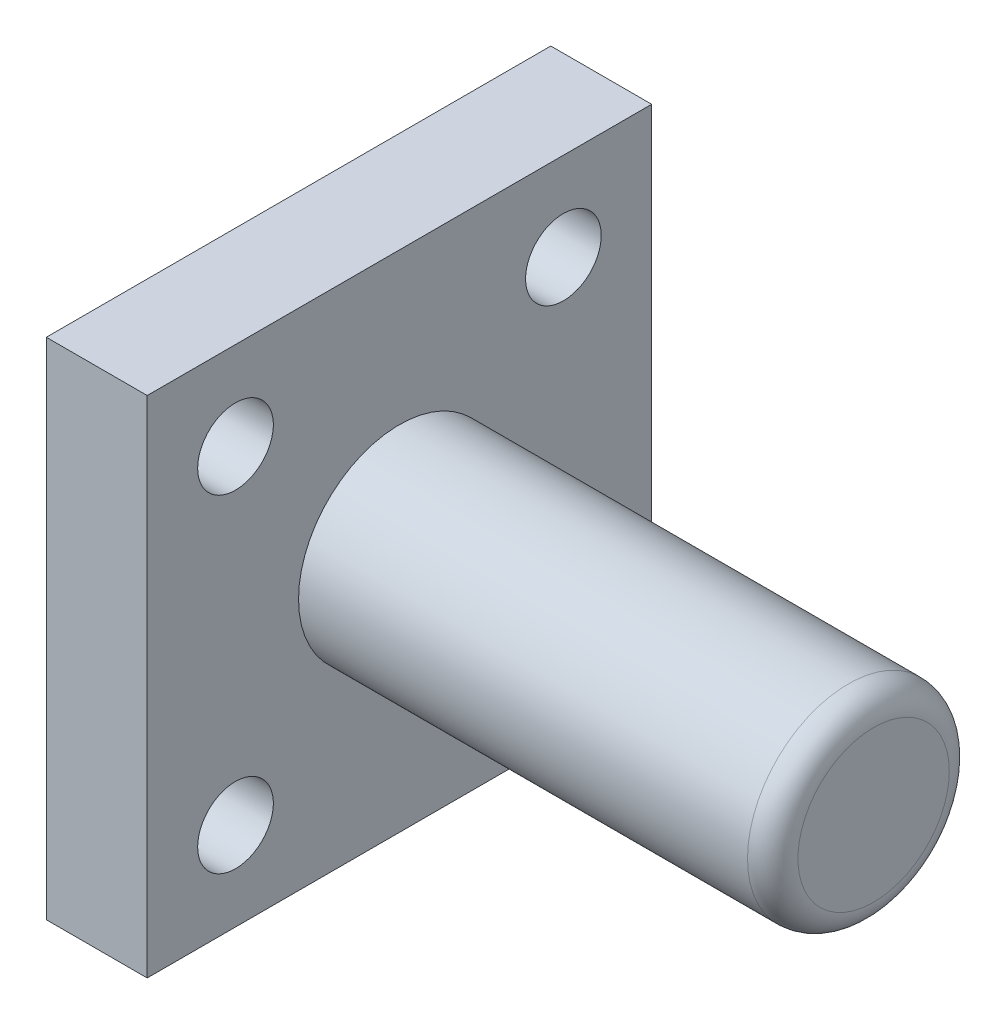
ISO-10303-21;
HEADER;
FILE_DESCRIPTION(('STEP AP214'),'2;1');
FILE_NAME('part.step','',(''),(''),'','','');
FILE_SCHEMA(('AUTOMOTIVE_DESIGN { 1 0 10303 214 1 1 1 1 }'));
ENDSEC;
DATA;
#1=APPLICATION_CONTEXT('core data for automotive mechanical design processes');
#2=APPLICATION_PROTOCOL_DEFINITION('international standard','automotive_design',2000,#1);
#3=PRODUCT_CONTEXT('',#1,'mechanical');
#4=PRODUCT('Part','Part','',(#3));
#5=PRODUCT_RELATED_PRODUCT_CATEGORY('part','',(#4));
#6=PRODUCT_DEFINITION_FORMATION('','',#4);
#7=PRODUCT_DEFINITION_CONTEXT('part definition',#1,'design');
#8=PRODUCT_DEFINITION('design','',#6,#7);
#9=PRODUCT_DEFINITION_SHAPE('','',#8);
#10=(LENGTH_UNIT() NAMED_UNIT(*) SI_UNIT(.MILLI.,.METRE.));
#11=(NAMED_UNIT(*) PLANE_ANGLE_UNIT() SI_UNIT($,.RADIAN.));
#12=(NAMED_UNIT(*) SI_UNIT($,.STERADIAN.) SOLID_ANGLE_UNIT());
#13=UNCERTAINTY_MEASURE_WITH_UNIT(LENGTH_MEASURE(1.E-05),#10,'distance_accuracy_value','');
#14=(GEOMETRIC_REPRESENTATION_CONTEXT(3) GLOBAL_UNCERTAINTY_ASSIGNED_CONTEXT((#13)) GLOBAL_UNIT_ASSIGNED_CONTEXT((#10,
#11,#12)) REPRESENTATION_CONTEXT('',''));
#15=CARTESIAN_POINT('',(0.,0.,0.));
#16=DIRECTION('',(0.,0.,1.));
#17=DIRECTION('',(1.,0.,0.));
#18=AXIS2_PLACEMENT_3D('',#15,#16,#17);
#19=CARTESIAN_POINT('',(4.,0.,0.));
#20=DIRECTION('',(-1.,0.,0.));
#21=DIRECTION('',(0.,0.,1.));
#22=AXIS2_PLACEMENT_3D('',#19,#20,#21);
#23=PLANE('',#22);
#24=CARTESIAN_POINT('',(4.,-6.5,-6.5));
#25=DIRECTION('',(-1.,0.,0.));
#26=DIRECTION('',(0.,0.,1.));
#27=AXIS2_PLACEMENT_3D('',#24,#25,#26);
#28=CIRCLE('',#27,1.5);
#29=CARTESIAN_POINT('',(4.,-6.5,-5.00000000000001));
#30=VERTEX_POINT('',#29);
#31=EDGE_CURVE('E255',#30,#30,#28,.T.);
#32=ORIENTED_EDGE('',*,*,#31,.T.);
#33=EDGE_LOOP('',(#32));
#34=FACE_BOUND('',#33,.T.);
#35=CARTESIAN_POINT('',(4.,6.5,-6.5));
#36=DIRECTION('',(-1.,0.,0.));
#37=DIRECTION('',(0.,0.,1.));
#38=AXIS2_PLACEMENT_3D('',#35,#36,#37);
#39=CIRCLE('',#38,1.5);
#40=CARTESIAN_POINT('',(4.,6.5,-5.00000000000001));
#41=VERTEX_POINT('',#40);
#42=EDGE_CURVE('E249',#41,#41,#39,.T.);
#43=ORIENTED_EDGE('',*,*,#42,.T.);
#44=EDGE_LOOP('',(#43));
#45=FACE_BOUND('',#44,.T.);
#46=CARTESIAN_POINT('',(4.,6.5,6.5));
#47=DIRECTION('',(-1.,0.,0.));
#48=DIRECTION('',(0.,0.,1.));
#49=AXIS2_PLACEMENT_3D('',#46,#47,#48);
#50=CIRCLE('',#49,1.5);
#51=CARTESIAN_POINT('',(4.,6.5,7.99999999999999));
#52=VERTEX_POINT('',#51);
#53=EDGE_CURVE('E253',#52,#52,#50,.T.);
#54=ORIENTED_EDGE('',*,*,#53,.T.);
#55=EDGE_LOOP('',(#54));
#56=FACE_BOUND('',#55,.T.);
#57=CARTESIAN_POINT('',(4.,-6.5,6.5));
#58=DIRECTION('',(-1.,0.,0.));
#59=DIRECTION('',(0.,0.,1.));
#60=AXIS2_PLACEMENT_3D('',#57,#58,#59);
#61=CIRCLE('',#60,1.5);
#62=CARTESIAN_POINT('',(4.,-6.5,7.99999999999999));
#63=VERTEX_POINT('',#62);
#64=EDGE_CURVE('E107',#63,#63,#61,.T.);
#65=ORIENTED_EDGE('',*,*,#64,.T.);
#66=EDGE_LOOP('',(#65));
#67=FACE_BOUND('',#66,.T.);
#68=DIRECTION('',(0.,1.,0.));
#69=VECTOR('',#68,1.);
#70=CARTESIAN_POINT('',(4.,-10.,-10.));
#71=LINE('',#70,#69);
#72=CARTESIAN_POINT('',(4.,-10.,-10.));
#73=VERTEX_POINT('',#72);
#74=CARTESIAN_POINT('',(4.,10.,-10.));
#75=VERTEX_POINT('',#74);
#76=EDGE_CURVE('E89',#73,#75,#71,.T.);
#77=ORIENTED_EDGE('',*,*,#76,.T.);
#78=DIRECTION('',(0.,0.,1.));
#79=VECTOR('',#78,1.);
#80=CARTESIAN_POINT('',(4.,10.,10.));
#81=LINE('',#80,#79);
#82=CARTESIAN_POINT('',(4.,10.,10.));
#83=VERTEX_POINT('',#82);
#84=EDGE_CURVE('E84',#75,#83,#81,.T.);
#85=ORIENTED_EDGE('',*,*,#84,.T.);
#86=DIRECTION('',(0.,-1.,0.));
#87=VECTOR('',#86,1.);
#88=CARTESIAN_POINT('',(4.,-10.,10.));
#89=LINE('',#88,#87);
#90=CARTESIAN_POINT('',(4.,-10.,10.));
#91=VERTEX_POINT('',#90);
#92=EDGE_CURVE('E87',#83,#91,#89,.T.);
#93=ORIENTED_EDGE('',*,*,#92,.T.);
#94=DIRECTION('',(0.,0.,-1.));
#95=VECTOR('',#94,1.);
#96=CARTESIAN_POINT('',(4.,-10.,10.));
#97=LINE('',#96,#95);
#98=EDGE_CURVE('E53',#91,#73,#97,.T.);
#99=ORIENTED_EDGE('',*,*,#98,.T.);
#100=EDGE_LOOP('',(#77,#85,#93,#99));
#101=FACE_BOUND('',#100,.T.);
#102=CARTESIAN_POINT('',(4.,0.,0.));
#103=DIRECTION('',(-1.,0.,0.));
#104=DIRECTION('',(0.,0.,1.));
#105=AXIS2_PLACEMENT_3D('',#102,#103,#104);
#106=CIRCLE('',#105,4.);
#107=CARTESIAN_POINT('',(4.,0.,4.));
#108=VERTEX_POINT('',#107);
#109=EDGE_CURVE('E114',#108,#108,#106,.F.);
#110=ORIENTED_EDGE('',*,*,#109,.F.);
#111=EDGE_LOOP('',(#110));
#112=FACE_BOUND('',#111,.T.);
#113=ADVANCED_FACE('F36',(#34,#45,#56,#67,#101,#112),#23,.F.);
#114=CARTESIAN_POINT('',(4.,-10.,-10.));
#115=DIRECTION('',(0.,0.,1.));
#116=DIRECTION('',(1.,0.,0.));
#117=AXIS2_PLACEMENT_3D('',#114,#115,#116);
#118=PLANE('',#117);
#119=DIRECTION('',(0.,1.,0.));
#120=VECTOR('',#119,1.);
#121=CARTESIAN_POINT('',(0.,-10.,-10.));
#122=LINE('',#121,#120);
#123=CARTESIAN_POINT('',(0.,-10.,-10.));
#124=VERTEX_POINT('',#123);
#125=CARTESIAN_POINT('',(0.,10.,-10.));
#126=VERTEX_POINT('',#125);
#127=EDGE_CURVE('E104',#124,#126,#122,.T.);
#128=ORIENTED_EDGE('',*,*,#127,.T.);
#129=DIRECTION('',(-1.,0.,0.));
#130=VECTOR('',#129,1.);
#131=CARTESIAN_POINT('',(4.,10.,-10.));
#132=LINE('',#131,#130);
#133=EDGE_CURVE('E95',#75,#126,#132,.T.);
#134=ORIENTED_EDGE('',*,*,#133,.F.);
#135=ORIENTED_EDGE('',*,*,#76,.F.);
#136=DIRECTION('',(-1.,0.,0.));
#137=VECTOR('',#136,1.);
#138=CARTESIAN_POINT('',(4.,-10.,-10.));
#139=LINE('',#138,#137);
#140=EDGE_CURVE('E100',#73,#124,#139,.T.);
#141=ORIENTED_EDGE('',*,*,#140,.T.);
#142=EDGE_LOOP('',(#128,#134,#135,#141));
#143=FACE_BOUND('',#142,.T.);
#144=ADVANCED_FACE('F132',(#143),#118,.F.);
#145=CARTESIAN_POINT('',(4.,10.,10.));
#146=DIRECTION('',(0.,-1.,0.));
#147=DIRECTION('',(0.,0.,-1.));
#148=AXIS2_PLACEMENT_3D('',#145,#146,#147);
#149=PLANE('',#148);
#150=DIRECTION('',(0.,0.,1.));
#151=VECTOR('',#150,1.);
#152=CARTESIAN_POINT('',(0.,10.,10.));
#153=LINE('',#152,#151);
#154=CARTESIAN_POINT('',(0.,10.,10.));
#155=VERTEX_POINT('',#154);
#156=EDGE_CURVE('E94',#126,#155,#153,.T.);
#157=ORIENTED_EDGE('',*,*,#156,.T.);
#158=DIRECTION('',(-1.,0.,0.));
#159=VECTOR('',#158,1.);
#160=CARTESIAN_POINT('',(4.,10.,10.));
#161=LINE('',#160,#159);
#162=EDGE_CURVE('E92',#83,#155,#161,.T.);
#163=ORIENTED_EDGE('',*,*,#162,.F.);
#164=ORIENTED_EDGE('',*,*,#84,.F.);
#165=ORIENTED_EDGE('',*,*,#133,.T.);
#166=EDGE_LOOP('',(#157,#163,#164,#165));
#167=FACE_BOUND('',#166,.T.);
#168=ADVANCED_FACE('F93',(#167),#149,.F.);
#169=CARTESIAN_POINT('',(4.,-10.,10.));
#170=DIRECTION('',(0.,0.,-1.));
#171=DIRECTION('',(-1.,0.,0.));
#172=AXIS2_PLACEMENT_3D('',#169,#170,#171);
#173=PLANE('',#172);
#174=DIRECTION('',(0.,-1.,0.));
#175=VECTOR('',#174,1.);
#176=CARTESIAN_POINT('',(0.,-10.,10.));
#177=LINE('',#176,#175);
#178=CARTESIAN_POINT('',(0.,-10.,10.));
#179=VERTEX_POINT('',#178);
#180=EDGE_CURVE('E70',#155,#179,#177,.T.);
#181=ORIENTED_EDGE('',*,*,#180,.T.);
#182=DIRECTION('',(-1.,0.,0.));
#183=VECTOR('',#182,1.);
#184=CARTESIAN_POINT('',(4.,-10.,10.));
#185=LINE('',#184,#183);
#186=EDGE_CURVE('E96',#91,#179,#185,.T.);
#187=ORIENTED_EDGE('',*,*,#186,.F.);
#188=ORIENTED_EDGE('',*,*,#92,.F.);
#189=ORIENTED_EDGE('',*,*,#162,.T.);
#190=EDGE_LOOP('',(#181,#187,#188,#189));
#191=FACE_BOUND('',#190,.T.);
#192=ADVANCED_FACE('F98',(#191),#173,.F.);
#193=CARTESIAN_POINT('',(4.,-10.,10.));
#194=DIRECTION('',(0.,1.,0.));
#195=DIRECTION('',(0.,0.,1.));
#196=AXIS2_PLACEMENT_3D('',#193,#194,#195);
#197=PLANE('',#196);
#198=DIRECTION('',(0.,0.,-1.));
#199=VECTOR('',#198,1.);
#200=CARTESIAN_POINT('',(0.,-10.,10.));
#201=LINE('',#200,#199);
#202=EDGE_CURVE('E76',#179,#124,#201,.T.);
#203=ORIENTED_EDGE('',*,*,#202,.T.);
#204=ORIENTED_EDGE('',*,*,#140,.F.);
#205=ORIENTED_EDGE('',*,*,#98,.F.);
#206=ORIENTED_EDGE('',*,*,#186,.T.);
#207=EDGE_LOOP('',(#203,#204,#205,#206));
#208=FACE_BOUND('',#207,.T.);
#209=ADVANCED_FACE('F148',(#208),#197,.F.);
#210=CARTESIAN_POINT('',(0.,0.,0.));
#211=DIRECTION('',(-1.,0.,0.));
#212=DIRECTION('',(0.,0.,1.));
#213=AXIS2_PLACEMENT_3D('',#210,#211,#212);
#214=PLANE('',#213);
#215=CARTESIAN_POINT('',(0.,-6.5,-6.5));
#216=DIRECTION('',(-1.,0.,0.));
#217=DIRECTION('',(0.,0.,1.));
#218=AXIS2_PLACEMENT_3D('',#215,#216,#217);
#219=CIRCLE('',#218,1.5);
#220=CARTESIAN_POINT('',(0.,-6.5,-5.00000000000001));
#221=VERTEX_POINT('',#220);
#222=EDGE_CURVE('E276',#221,#221,#219,.T.);
#223=ORIENTED_EDGE('',*,*,#222,.F.);
#224=EDGE_LOOP('',(#223));
#225=FACE_BOUND('',#224,.T.);
#226=CARTESIAN_POINT('',(0.,6.5,-6.5));
#227=DIRECTION('',(-1.,0.,0.));
#228=DIRECTION('',(0.,0.,1.));
#229=AXIS2_PLACEMENT_3D('',#226,#227,#228);
#230=CIRCLE('',#229,1.5);
#231=CARTESIAN_POINT('',(0.,6.5,-5.));
#232=VERTEX_POINT('',#231);
#233=EDGE_CURVE('E246',#232,#232,#230,.T.);
#234=ORIENTED_EDGE('',*,*,#233,.F.);
#235=EDGE_LOOP('',(#234));
#236=FACE_BOUND('',#235,.T.);
#237=CARTESIAN_POINT('',(0.,6.5,6.5));
#238=DIRECTION('',(-1.,0.,0.));
#239=DIRECTION('',(0.,0.,1.));
#240=AXIS2_PLACEMENT_3D('',#237,#238,#239);
#241=CIRCLE('',#240,1.5);
#242=CARTESIAN_POINT('',(0.,6.5,8.));
#243=VERTEX_POINT('',#242);
#244=EDGE_CURVE('E250',#243,#243,#241,.T.);
#245=ORIENTED_EDGE('',*,*,#244,.F.);
#246=EDGE_LOOP('',(#245));
#247=FACE_BOUND('',#246,.T.);
#248=CARTESIAN_POINT('',(0.,-6.5,6.5));
#249=DIRECTION('',(-1.,0.,0.));
#250=DIRECTION('',(0.,0.,1.));
#251=AXIS2_PLACEMENT_3D('',#248,#249,#250);
#252=CIRCLE('',#251,1.5);
#253=CARTESIAN_POINT('',(0.,-6.5,8.));
#254=VERTEX_POINT('',#253);
#255=EDGE_CURVE('E261',#254,#254,#252,.T.);
#256=ORIENTED_EDGE('',*,*,#255,.F.);
#257=EDGE_LOOP('',(#256));
#258=FACE_BOUND('',#257,.T.);
#259=ORIENTED_EDGE('',*,*,#127,.F.);
#260=ORIENTED_EDGE('',*,*,#202,.F.);
#261=ORIENTED_EDGE('',*,*,#180,.F.);
#262=ORIENTED_EDGE('',*,*,#156,.F.);
#263=EDGE_LOOP('',(#259,#260,#261,#262));
#264=FACE_BOUND('',#263,.T.);
#265=ADVANCED_FACE('F145',(#225,#236,#247,#258,#264),#214,.T.);
#266=CARTESIAN_POINT('',(22.8,0.,0.));
#267=DIRECTION('',(-1.,0.,0.));
#268=DIRECTION('',(0.,0.,1.));
#269=AXIS2_PLACEMENT_3D('',#266,#267,#268);
#270=CYLINDRICAL_SURFACE('',#269,4.);
#271=CARTESIAN_POINT('',(21.8,0.,0.));
#272=DIRECTION('',(1.,0.,0.));
#273=DIRECTION('',(0.,0.,-1.));
#274=AXIS2_PLACEMENT_3D('',#271,#272,#273);
#275=CIRCLE('',#274,4.);
#276=CARTESIAN_POINT('',(21.8,0.,-4.));
#277=VERTEX_POINT('',#276);
#278=EDGE_CURVE('E11',#277,#277,#275,.F.);
#279=ORIENTED_EDGE('',*,*,#278,.T.);
#280=EDGE_LOOP('',(#279));
#281=FACE_BOUND('',#280,.T.);
#282=ORIENTED_EDGE('',*,*,#109,.T.);
#283=EDGE_LOOP('',(#282));
#284=FACE_BOUND('',#283,.T.);
#285=ADVANCED_FACE('F143',(#281,#284),#270,.T.);
#286=CARTESIAN_POINT('',(22.8,0.,0.));
#287=DIRECTION('',(1.,0.,0.));
#288=DIRECTION('',(0.,0.,-1.));
#289=AXIS2_PLACEMENT_3D('',#286,#287,#288);
#290=PLANE('',#289);
#291=CARTESIAN_POINT('',(22.8,0.,0.));
#292=DIRECTION('',(1.,0.,0.));
#293=DIRECTION('',(0.,0.,-1.));
#294=AXIS2_PLACEMENT_3D('',#291,#292,#293);
#295=CIRCLE('',#294,3.);
#296=CARTESIAN_POINT('',(22.8,0.,-3.));
#297=VERTEX_POINT('',#296);
#298=EDGE_CURVE('E45',#297,#297,#295,.T.);
#299=ORIENTED_EDGE('',*,*,#298,.T.);
#300=EDGE_LOOP('',(#299));
#301=FACE_BOUND('',#300,.T.);
#302=ADVANCED_FACE('F119',(#301),#290,.T.);
#303=CARTESIAN_POINT('',(0.,-6.5,6.5));
#304=DIRECTION('',(-1.,0.,0.));
#305=DIRECTION('',(0.,0.,1.));
#306=AXIS2_PLACEMENT_3D('',#303,#304,#305);
#307=CYLINDRICAL_SURFACE('',#306,1.5);
#308=ORIENTED_EDGE('',*,*,#255,.T.);
#309=EDGE_LOOP('',(#308));
#310=FACE_BOUND('',#309,.T.);
#311=ORIENTED_EDGE('',*,*,#64,.F.);
#312=EDGE_LOOP('',(#311));
#313=FACE_BOUND('',#312,.T.);
#314=ADVANCED_FACE('F185',(#310,#313),#307,.F.);
#315=CARTESIAN_POINT('',(0.,6.5,6.5));
#316=DIRECTION('',(-1.,0.,0.));
#317=DIRECTION('',(0.,0.,1.));
#318=AXIS2_PLACEMENT_3D('',#315,#316,#317);
#319=CYLINDRICAL_SURFACE('',#318,1.5);
#320=ORIENTED_EDGE('',*,*,#244,.T.);
#321=EDGE_LOOP('',(#320));
#322=FACE_BOUND('',#321,.T.);
#323=ORIENTED_EDGE('',*,*,#53,.F.);
#324=EDGE_LOOP('',(#323));
#325=FACE_BOUND('',#324,.T.);
#326=ADVANCED_FACE('F190',(#322,#325),#319,.F.);
#327=CARTESIAN_POINT('',(0.,6.5,-6.5));
#328=DIRECTION('',(-1.,0.,0.));
#329=DIRECTION('',(0.,0.,1.));
#330=AXIS2_PLACEMENT_3D('',#327,#328,#329);
#331=CYLINDRICAL_SURFACE('',#330,1.5);
#332=ORIENTED_EDGE('',*,*,#233,.T.);
#333=EDGE_LOOP('',(#332));
#334=FACE_BOUND('',#333,.T.);
#335=ORIENTED_EDGE('',*,*,#42,.F.);
#336=EDGE_LOOP('',(#335));
#337=FACE_BOUND('',#336,.T.);
#338=ADVANCED_FACE('F127',(#334,#337),#331,.F.);
#339=CARTESIAN_POINT('',(0.,-6.5,-6.5));
#340=DIRECTION('',(-1.,0.,0.));
#341=DIRECTION('',(0.,0.,1.));
#342=AXIS2_PLACEMENT_3D('',#339,#340,#341);
#343=CYLINDRICAL_SURFACE('',#342,1.5);
#344=ORIENTED_EDGE('',*,*,#222,.T.);
#345=EDGE_LOOP('',(#344));
#346=FACE_BOUND('',#345,.T.);
#347=ORIENTED_EDGE('',*,*,#31,.F.);
#348=EDGE_LOOP('',(#347));
#349=FACE_BOUND('',#348,.T.);
#350=ADVANCED_FACE('F122',(#346,#349),#343,.F.);
#351=CARTESIAN_POINT('',(21.8,0.,0.));
#352=DIRECTION('',(1.,0.,0.));
#353=DIRECTION('',(0.,0.,-1.));
#354=AXIS2_PLACEMENT_3D('',#351,#352,#353);
#355=TOROIDAL_SURFACE('',#354,3.,1.);
#356=ORIENTED_EDGE('',*,*,#278,.F.);
#357=EDGE_LOOP('',(#356));
#358=FACE_BOUND('',#357,.T.);
#359=ORIENTED_EDGE('',*,*,#298,.F.);
#360=EDGE_LOOP('',(#359));
#361=FACE_BOUND('',#360,.T.);
#362=ADVANCED_FACE('F38',(#358,#361),#355,.T.);
#363=CLOSED_SHELL('',(#113,#144,#168,#192,#209,#265,#285,#302,#314,#326,#338,#350,#362));
#364=MANIFOLD_SOLID_BREP('B2',#363);
#365=ADVANCED_BREP_SHAPE_REPRESENTATION('',(#18,#364),#14);
#366=SHAPE_DEFINITION_REPRESENTATION(#9,#365);
ENDSEC;
END-ISO-10303-21;
